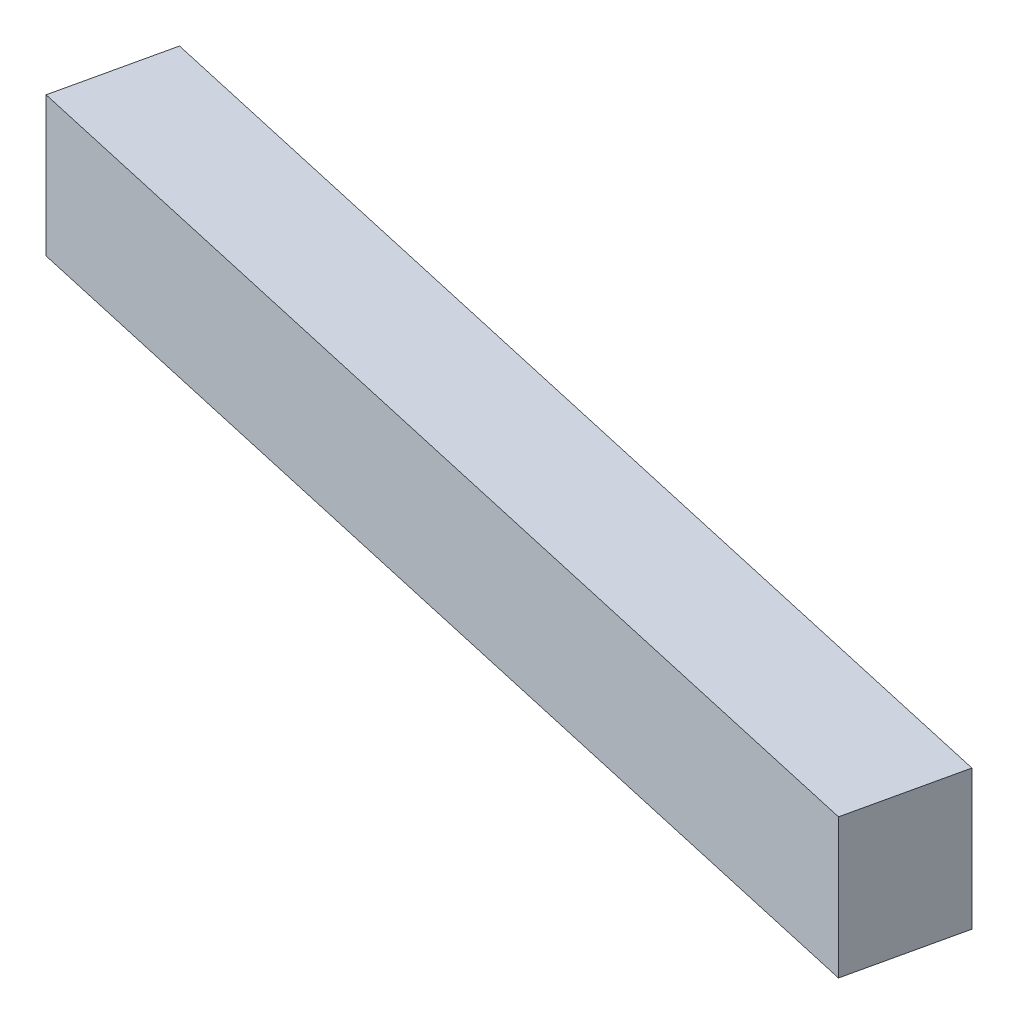
ISO-10303-21;
HEADER;
FILE_DESCRIPTION(('STEP AP214'),'2;1');
FILE_NAME('part.step','',(''),(''),'','','');
FILE_SCHEMA(('AUTOMOTIVE_DESIGN { 1 0 10303 214 1 1 1 1 }'));
ENDSEC;
DATA;
#1=APPLICATION_CONTEXT('core data for automotive mechanical design processes');
#2=APPLICATION_PROTOCOL_DEFINITION('international standard','automotive_design',2000,#1);
#3=PRODUCT_CONTEXT('',#1,'mechanical');
#4=PRODUCT('Part','Part','',(#3));
#5=PRODUCT_RELATED_PRODUCT_CATEGORY('part','',(#4));
#6=PRODUCT_DEFINITION_FORMATION('','',#4);
#7=PRODUCT_DEFINITION_CONTEXT('part definition',#1,'design');
#8=PRODUCT_DEFINITION('design','',#6,#7);
#9=PRODUCT_DEFINITION_SHAPE('','',#8);
#10=(LENGTH_UNIT() NAMED_UNIT(*) SI_UNIT(.MILLI.,.METRE.));
#11=(NAMED_UNIT(*) PLANE_ANGLE_UNIT() SI_UNIT($,.RADIAN.));
#12=(NAMED_UNIT(*) SI_UNIT($,.STERADIAN.) SOLID_ANGLE_UNIT());
#13=UNCERTAINTY_MEASURE_WITH_UNIT(LENGTH_MEASURE(1.E-05),#10,'distance_accuracy_value','');
#14=(GEOMETRIC_REPRESENTATION_CONTEXT(3) GLOBAL_UNCERTAINTY_ASSIGNED_CONTEXT((#13)) GLOBAL_UNIT_ASSIGNED_CONTEXT((#10,
#11,#12)) REPRESENTATION_CONTEXT('',''));
#15=CARTESIAN_POINT('',(0.,0.,0.));
#16=DIRECTION('',(0.,0.,1.));
#17=DIRECTION('',(1.,0.,0.));
#18=AXIS2_PLACEMENT_3D('',#15,#16,#17);
#19=CARTESIAN_POINT('',(17.5836780095773,7.874,3.84065491634453));
#20=DIRECTION('',(-0.218858567072598,0.,0.97575659240352));
#21=DIRECTION('',(0.97575659240352,0.,0.218858567072598));
#22=AXIS2_PLACEMENT_3D('',#19,#20,#21);
#23=PLANE('',#22);
#24=DIRECTION('',(0.,1.,0.));
#25=VECTOR('',#24,1.);
#26=CARTESIAN_POINT('',(17.5836780095773,7.874,3.84065491634453));
#27=LINE('',#26,#25);
#28=CARTESIAN_POINT('',(17.5836780095773,7.62,3.84065491634453));
#29=VERTEX_POINT('',#28);
#30=CARTESIAN_POINT('',(17.5836780095773,7.874,3.84065491634453));
#31=VERTEX_POINT('',#30);
#32=EDGE_CURVE('E20',#29,#31,#27,.T.);
#33=ORIENTED_EDGE('',*,*,#32,.T.);
#34=DIRECTION('',(0.97575659240352,0.,0.2188585670726));
#35=VECTOR('',#34,1.);
#36=CARTESIAN_POINT('',(17.5836780095773,7.874,3.84065491634453));
#37=LINE('',#36,#35);
#38=CARTESIAN_POINT('',(19.442494318106,7.874,4.25758048661783));
#39=VERTEX_POINT('',#38);
#40=EDGE_CURVE('E55',#31,#39,#37,.T.);
#41=ORIENTED_EDGE('',*,*,#40,.T.);
#42=DIRECTION('',(0.,1.,0.));
#43=VECTOR('',#42,1.);
#44=CARTESIAN_POINT('',(19.442494318106,7.874,4.25758048661783));
#45=LINE('',#44,#43);
#46=CARTESIAN_POINT('',(19.442494318106,7.62,4.25758048661783));
#47=VERTEX_POINT('',#46);
#48=EDGE_CURVE('E76',#39,#47,#45,.F.);
#49=ORIENTED_EDGE('',*,*,#48,.T.);
#50=DIRECTION('',(0.97575659240352,0.,0.2188585670726));
#51=VECTOR('',#50,1.);
#52=CARTESIAN_POINT('',(17.5836780095773,7.62,3.84065491634453));
#53=LINE('',#52,#51);
#54=EDGE_CURVE('E58',#29,#47,#53,.T.);
#55=ORIENTED_EDGE('',*,*,#54,.F.);
#56=EDGE_LOOP('',(#33,#41,#49,#55));
#57=FACE_BOUND('',#56,.T.);
#58=ADVANCED_FACE('F17',(#57),#23,.F.);
#59=CARTESIAN_POINT('',(17.5836780095773,7.874,3.84065491634453));
#60=DIRECTION('',(0.975756592403529,0.,0.218858567072559));
#61=DIRECTION('',(0.218858567072559,0.,-0.975756592403529));
#62=AXIS2_PLACEMENT_3D('',#59,#60,#61);
#63=PLANE('',#62);
#64=DIRECTION('',(0.,1.,0.));
#65=VECTOR('',#64,1.);
#66=CARTESIAN_POINT('',(17.5392059487481,7.874,4.03892865592093));
#67=LINE('',#66,#65);
#68=CARTESIAN_POINT('',(17.5392059487481,7.62,4.03892865592094));
#69=VERTEX_POINT('',#68);
#70=CARTESIAN_POINT('',(17.5392059487481,7.874,4.03892865592094));
#71=VERTEX_POINT('',#70);
#72=EDGE_CURVE('E73',#69,#71,#67,.T.);
#73=ORIENTED_EDGE('',*,*,#72,.T.);
#74=DIRECTION('',(0.218858567072816,0.,-0.975756592403471));
#75=VECTOR('',#74,1.);
#76=CARTESIAN_POINT('',(17.5392059487481,7.874,4.03892865592093));
#77=LINE('',#76,#75);
#78=EDGE_CURVE('E63',#71,#31,#77,.T.);
#79=ORIENTED_EDGE('',*,*,#78,.T.);
#80=ORIENTED_EDGE('',*,*,#32,.F.);
#81=DIRECTION('',(0.218858567072816,0.,-0.975756592403471));
#82=VECTOR('',#81,1.);
#83=CARTESIAN_POINT('',(17.5392059487481,7.62,4.03892865592093));
#84=LINE('',#83,#82);
#85=EDGE_CURVE('E80',#69,#29,#84,.T.);
#86=ORIENTED_EDGE('',*,*,#85,.F.);
#87=EDGE_LOOP('',(#73,#79,#80,#86));
#88=FACE_BOUND('',#87,.T.);
#89=ADVANCED_FACE('F72',(#88),#63,.F.);
#90=CARTESIAN_POINT('',(17.5836780095773,7.874,3.84065491634453));
#91=DIRECTION('',(0.,-1.,0.));
#92=DIRECTION('',(0.,0.,-1.));
#93=AXIS2_PLACEMENT_3D('',#90,#91,#92);
#94=PLANE('',#93);
#95=ORIENTED_EDGE('',*,*,#78,.F.);
#96=DIRECTION('',(-0.97575659240352,0.,-0.2188585670726));
#97=VECTOR('',#96,1.);
#98=CARTESIAN_POINT('',(17.5392059487481,7.874,4.03892865592093));
#99=LINE('',#98,#97);
#100=CARTESIAN_POINT('',(19.3980222575787,7.874,4.45585422626193));
#101=VERTEX_POINT('',#100);
#102=EDGE_CURVE('E83',#71,#101,#99,.F.);
#103=ORIENTED_EDGE('',*,*,#102,.T.);
#104=DIRECTION('',(-0.218858565587214,0.,0.975756592736686));
#105=VECTOR('',#104,1.);
#106=CARTESIAN_POINT('',(19.442494318106,7.874,4.25758048661783));
#107=LINE('',#106,#105);
#108=EDGE_CURVE('E69',#101,#39,#107,.F.);
#109=ORIENTED_EDGE('',*,*,#108,.T.);
#110=ORIENTED_EDGE('',*,*,#40,.F.);
#111=EDGE_LOOP('',(#95,#103,#109,#110));
#112=FACE_BOUND('',#111,.T.);
#113=ADVANCED_FACE('F66',(#112),#94,.F.);
#114=CARTESIAN_POINT('',(19.442494318106,7.874,4.25758048661783));
#115=DIRECTION('',(-0.975756592736686,0.,-0.218858565587214));
#116=DIRECTION('',(-0.218858565587214,0.,0.975756592736686));
#117=AXIS2_PLACEMENT_3D('',#114,#115,#116);
#118=PLANE('',#117);
#119=ORIENTED_EDGE('',*,*,#48,.F.);
#120=ORIENTED_EDGE('',*,*,#108,.F.);
#121=DIRECTION('',(0.,1.,0.));
#122=VECTOR('',#121,1.);
#123=CARTESIAN_POINT('',(19.3980222575787,7.874,4.45585422626195));
#124=LINE('',#123,#122);
#125=CARTESIAN_POINT('',(19.3980222575787,7.62,4.45585422626193));
#126=VERTEX_POINT('',#125);
#127=EDGE_CURVE('E26',#101,#126,#124,.F.);
#128=ORIENTED_EDGE('',*,*,#127,.T.);
#129=DIRECTION('',(-0.218858565587117,0.,0.975756592736708));
#130=VECTOR('',#129,1.);
#131=CARTESIAN_POINT('',(19.442494318106,7.62,4.25758048661783));
#132=LINE('',#131,#130);
#133=EDGE_CURVE('E34',#47,#126,#132,.T.);
#134=ORIENTED_EDGE('',*,*,#133,.F.);
#135=EDGE_LOOP('',(#119,#120,#128,#134));
#136=FACE_BOUND('',#135,.T.);
#137=ADVANCED_FACE('F88',(#136),#118,.F.);
#138=CARTESIAN_POINT('',(17.5836780095773,7.62,3.84065491634453));
#139=DIRECTION('',(0.,-1.,0.));
#140=DIRECTION('',(0.,0.,-1.));
#141=AXIS2_PLACEMENT_3D('',#138,#139,#140);
#142=PLANE('',#141);
#143=DIRECTION('',(-0.97575659240352,0.,-0.2188585670726));
#144=VECTOR('',#143,1.);
#145=CARTESIAN_POINT('',(17.5392059487481,7.62,4.03892865592093));
#146=LINE('',#145,#144);
#147=EDGE_CURVE('E11',#126,#69,#146,.T.);
#148=ORIENTED_EDGE('',*,*,#147,.T.);
#149=ORIENTED_EDGE('',*,*,#85,.T.);
#150=ORIENTED_EDGE('',*,*,#54,.T.);
#151=ORIENTED_EDGE('',*,*,#133,.T.);
#152=EDGE_LOOP('',(#148,#149,#150,#151));
#153=FACE_BOUND('',#152,.T.);
#154=ADVANCED_FACE('F91',(#153),#142,.T.);
#155=CARTESIAN_POINT('',(17.5392059487481,7.874,4.03892865592093));
#156=DIRECTION('',(0.2188585670726,0.,-0.97575659240352));
#157=DIRECTION('',(-0.97575659240352,0.,-0.2188585670726));
#158=AXIS2_PLACEMENT_3D('',#155,#156,#157);
#159=PLANE('',#158);
#160=ORIENTED_EDGE('',*,*,#127,.F.);
#161=ORIENTED_EDGE('',*,*,#102,.F.);
#162=ORIENTED_EDGE('',*,*,#72,.F.);
#163=ORIENTED_EDGE('',*,*,#147,.F.);
#164=EDGE_LOOP('',(#160,#161,#162,#163));
#165=FACE_BOUND('',#164,.T.);
#166=ADVANCED_FACE('F90',(#165),#159,.F.);
#167=CLOSED_SHELL('',(#58,#89,#113,#137,#154,#166));
#168=MANIFOLD_SOLID_BREP('B1',#167);
#169=ADVANCED_BREP_SHAPE_REPRESENTATION('',(#18,#168),#14);
#170=SHAPE_DEFINITION_REPRESENTATION(#9,#169);
ENDSEC;
END-ISO-10303-21;
